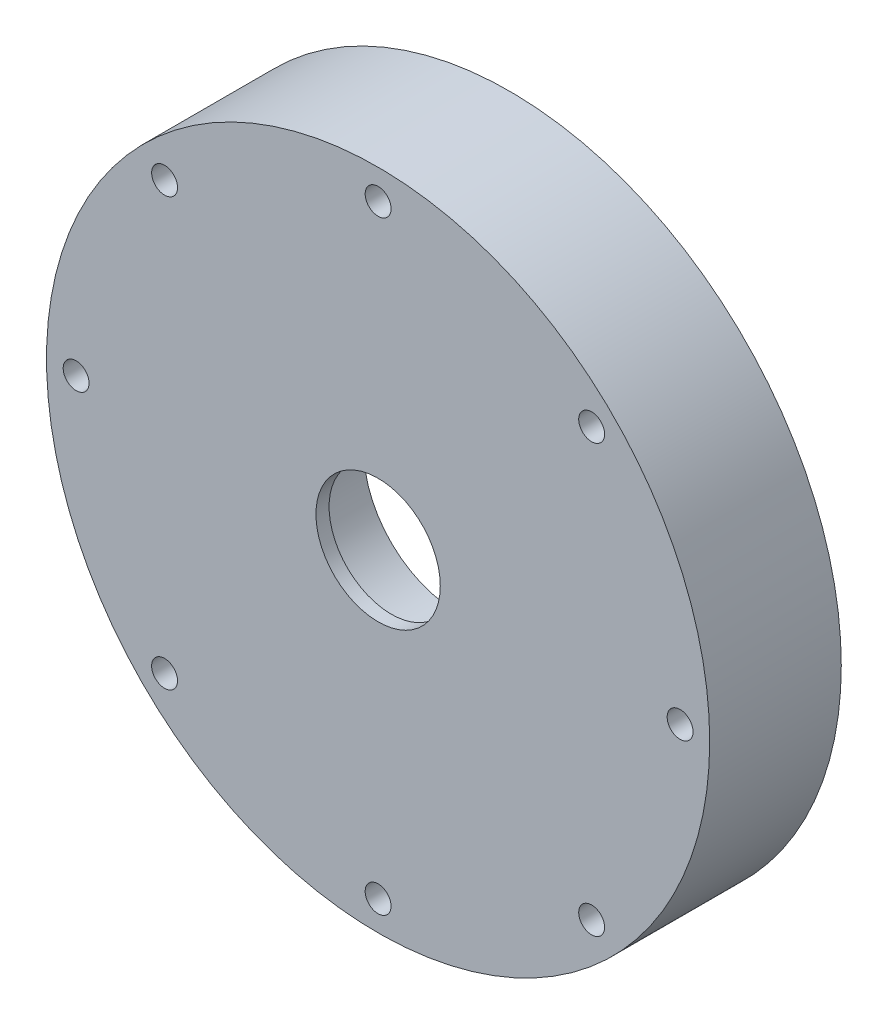
ISO-10303-21;
HEADER;
FILE_DESCRIPTION(('STEP AP214'),'2;1');
FILE_NAME('part.step','',(''),(''),'','','');
FILE_SCHEMA(('AUTOMOTIVE_DESIGN { 1 0 10303 214 1 1 1 1 }'));
ENDSEC;
DATA;
#1=APPLICATION_CONTEXT('core data for automotive mechanical design processes');
#2=APPLICATION_PROTOCOL_DEFINITION('international standard','automotive_design',2000,#1);
#3=PRODUCT_CONTEXT('',#1,'mechanical');
#4=PRODUCT('Part','Part','',(#3));
#5=PRODUCT_RELATED_PRODUCT_CATEGORY('part','',(#4));
#6=PRODUCT_DEFINITION_FORMATION('','',#4);
#7=PRODUCT_DEFINITION_CONTEXT('part definition',#1,'design');
#8=PRODUCT_DEFINITION('design','',#6,#7);
#9=PRODUCT_DEFINITION_SHAPE('','',#8);
#10=(LENGTH_UNIT() NAMED_UNIT(*) SI_UNIT(.MILLI.,.METRE.));
#11=(NAMED_UNIT(*) PLANE_ANGLE_UNIT() SI_UNIT($,.RADIAN.));
#12=(NAMED_UNIT(*) SI_UNIT($,.STERADIAN.) SOLID_ANGLE_UNIT());
#13=UNCERTAINTY_MEASURE_WITH_UNIT(LENGTH_MEASURE(1.E-05),#10,'distance_accuracy_value','');
#14=(GEOMETRIC_REPRESENTATION_CONTEXT(3) GLOBAL_UNCERTAINTY_ASSIGNED_CONTEXT((#13)) GLOBAL_UNIT_ASSIGNED_CONTEXT((#10,
#11,#12)) REPRESENTATION_CONTEXT('',''));
#15=CARTESIAN_POINT('',(0.,0.,0.));
#16=DIRECTION('',(0.,0.,1.));
#17=DIRECTION('',(1.,0.,0.));
#18=AXIS2_PLACEMENT_3D('',#15,#16,#17);
#19=CARTESIAN_POINT('',(0.,0.,0.));
#20=DIRECTION('',(0.,0.,-1.));
#21=DIRECTION('',(1.,0.,0.));
#22=AXIS2_PLACEMENT_3D('',#19,#20,#21);
#23=CYLINDRICAL_SURFACE('',#22,6.);
#24=CARTESIAN_POINT('',(0.,0.,0.));
#25=DIRECTION('',(0.,0.,1.));
#26=DIRECTION('',(1.,0.,0.));
#27=AXIS2_PLACEMENT_3D('',#24,#25,#26);
#28=CIRCLE('',#27,6.);
#29=CARTESIAN_POINT('',(6.,0.,0.));
#30=VERTEX_POINT('',#29);
#31=EDGE_CURVE('E163',#30,#30,#28,.T.);
#32=ORIENTED_EDGE('',*,*,#31,.T.);
#33=EDGE_LOOP('',(#32));
#34=FACE_BOUND('',#33,.T.);
#35=CARTESIAN_POINT('',(0.,0.,-1.27));
#36=DIRECTION('',(0.,0.,1.));
#37=DIRECTION('',(1.,0.,0.));
#38=AXIS2_PLACEMENT_3D('',#35,#36,#37);
#39=CIRCLE('',#38,6.);
#40=CARTESIAN_POINT('',(6.,0.,-1.27));
#41=VERTEX_POINT('',#40);
#42=EDGE_CURVE('E220',#41,#41,#39,.T.);
#43=ORIENTED_EDGE('',*,*,#42,.F.);
#44=EDGE_LOOP('',(#43));
#45=FACE_BOUND('',#44,.T.);
#46=ADVANCED_FACE('F45',(#34,#45),#23,.F.);
#47=CARTESIAN_POINT('',(0.,0.,-12.7));
#48=DIRECTION('',(0.,0.,1.));
#49=DIRECTION('',(-1.,0.,0.));
#50=AXIS2_PLACEMENT_3D('',#47,#48,#49);
#51=CYLINDRICAL_SURFACE('',#50,32.004);
#52=CARTESIAN_POINT('',(0.,0.,-12.7));
#53=DIRECTION('',(0.,0.,1.));
#54=DIRECTION('',(1.,0.,0.));
#55=AXIS2_PLACEMENT_3D('',#52,#53,#54);
#56=CIRCLE('',#55,32.004);
#57=CARTESIAN_POINT('',(32.004,0.,-12.7));
#58=VERTEX_POINT('',#57);
#59=EDGE_CURVE('E10',#58,#58,#56,.T.);
#60=ORIENTED_EDGE('',*,*,#59,.T.);
#61=EDGE_LOOP('',(#60));
#62=FACE_BOUND('',#61,.T.);
#63=CARTESIAN_POINT('',(0.,0.,0.));
#64=DIRECTION('',(0.,0.,1.));
#65=DIRECTION('',(1.,0.,0.));
#66=AXIS2_PLACEMENT_3D('',#63,#64,#65);
#67=CIRCLE('',#66,32.004);
#68=CARTESIAN_POINT('',(32.004,0.,0.));
#69=VERTEX_POINT('',#68);
#70=EDGE_CURVE('E49',#69,#69,#67,.T.);
#71=ORIENTED_EDGE('',*,*,#70,.F.);
#72=EDGE_LOOP('',(#71));
#73=FACE_BOUND('',#72,.T.);
#74=ADVANCED_FACE('F47',(#62,#73),#51,.T.);
#75=CARTESIAN_POINT('',(0.,0.,-12.7));
#76=DIRECTION('',(0.,0.,-1.));
#77=DIRECTION('',(1.,0.,0.));
#78=AXIS2_PLACEMENT_3D('',#75,#76,#77);
#79=PLANE('',#78);
#80=CARTESIAN_POINT('',(0.,29.1465,-12.7));
#81=DIRECTION('',(0.,0.,1.));
#82=DIRECTION('',(1.,0.,0.));
#83=AXIS2_PLACEMENT_3D('',#80,#81,#82);
#84=CIRCLE('',#83,1.25);
#85=CARTESIAN_POINT('',(1.25,29.1465,-12.7));
#86=VERTEX_POINT('',#85);
#87=EDGE_CURVE('E213',#86,#86,#84,.T.);
#88=ORIENTED_EDGE('',*,*,#87,.T.);
#89=EDGE_LOOP('',(#88));
#90=FACE_BOUND('',#89,.T.);
#91=CARTESIAN_POINT('',(20.6096877978537,20.6096877978537,-12.7));
#92=DIRECTION('',(0.,0.,1.));
#93=DIRECTION('',(1.,0.,0.));
#94=AXIS2_PLACEMENT_3D('',#91,#92,#93);
#95=CIRCLE('',#94,1.25);
#96=CARTESIAN_POINT('',(21.8596877978537,20.6096877978537,-12.7));
#97=VERTEX_POINT('',#96);
#98=EDGE_CURVE('E207',#97,#97,#95,.T.);
#99=ORIENTED_EDGE('',*,*,#98,.T.);
#100=EDGE_LOOP('',(#99));
#101=FACE_BOUND('',#100,.T.);
#102=CARTESIAN_POINT('',(29.1465,-1.01764460842591E-13,-12.7));
#103=DIRECTION('',(0.,0.,1.));
#104=DIRECTION('',(1.,0.,0.));
#105=AXIS2_PLACEMENT_3D('',#102,#103,#104);
#106=CIRCLE('',#105,1.25);
#107=CARTESIAN_POINT('',(30.3965,-1.01764460842591E-13,-12.7));
#108=VERTEX_POINT('',#107);
#109=EDGE_CURVE('E201',#108,#108,#106,.T.);
#110=ORIENTED_EDGE('',*,*,#109,.T.);
#111=EDGE_LOOP('',(#110));
#112=FACE_BOUND('',#111,.T.);
#113=CARTESIAN_POINT('',(20.6096877978536,-20.6096877978538,-12.7));
#114=DIRECTION('',(0.,0.,1.));
#115=DIRECTION('',(1.,0.,0.));
#116=AXIS2_PLACEMENT_3D('',#113,#114,#115);
#117=CIRCLE('',#116,1.25);
#118=CARTESIAN_POINT('',(21.8596877978536,-20.6096877978538,-12.7));
#119=VERTEX_POINT('',#118);
#120=EDGE_CURVE('E195',#119,#119,#117,.T.);
#121=ORIENTED_EDGE('',*,*,#120,.T.);
#122=EDGE_LOOP('',(#121));
#123=FACE_BOUND('',#122,.T.);
#124=CARTESIAN_POINT('',(-2.03528921685183E-13,-29.1465,-12.7));
#125=DIRECTION('',(0.,0.,1.));
#126=DIRECTION('',(1.,0.,0.));
#127=AXIS2_PLACEMENT_3D('',#124,#125,#126);
#128=CIRCLE('',#127,1.25);
#129=CARTESIAN_POINT('',(1.24999999999979,-29.1465,-12.7));
#130=VERTEX_POINT('',#129);
#131=EDGE_CURVE('E189',#130,#130,#128,.T.);
#132=ORIENTED_EDGE('',*,*,#131,.T.);
#133=EDGE_LOOP('',(#132));
#134=FACE_BOUND('',#133,.T.);
#135=CARTESIAN_POINT('',(-20.6096877978539,-20.6096877978535,-12.7));
#136=DIRECTION('',(0.,0.,1.));
#137=DIRECTION('',(1.,0.,0.));
#138=AXIS2_PLACEMENT_3D('',#135,#136,#137);
#139=CIRCLE('',#138,1.25);
#140=CARTESIAN_POINT('',(-19.3596877978539,-20.6096877978535,-12.7));
#141=VERTEX_POINT('',#140);
#142=EDGE_CURVE('E183',#141,#141,#139,.T.);
#143=ORIENTED_EDGE('',*,*,#142,.T.);
#144=EDGE_LOOP('',(#143));
#145=FACE_BOUND('',#144,.T.);
#146=CARTESIAN_POINT('',(-29.1465,3.05293382527774E-13,-12.7));
#147=DIRECTION('',(0.,0.,1.));
#148=DIRECTION('',(1.,0.,0.));
#149=AXIS2_PLACEMENT_3D('',#146,#147,#148);
#150=CIRCLE('',#149,1.25);
#151=CARTESIAN_POINT('',(-27.8965,3.05293382527774E-13,-12.7));
#152=VERTEX_POINT('',#151);
#153=EDGE_CURVE('E177',#152,#152,#150,.T.);
#154=ORIENTED_EDGE('',*,*,#153,.T.);
#155=EDGE_LOOP('',(#154));
#156=FACE_BOUND('',#155,.T.);
#157=CARTESIAN_POINT('',(-20.6096877978535,20.609687797854,-12.7));
#158=DIRECTION('',(0.,0.,1.));
#159=DIRECTION('',(1.,0.,0.));
#160=AXIS2_PLACEMENT_3D('',#157,#158,#159);
#161=CIRCLE('',#160,1.25);
#162=CARTESIAN_POINT('',(-19.3596877978535,20.609687797854,-12.7));
#163=VERTEX_POINT('',#162);
#164=EDGE_CURVE('E171',#163,#163,#161,.T.);
#165=ORIENTED_EDGE('',*,*,#164,.T.);
#166=EDGE_LOOP('',(#165));
#167=FACE_BOUND('',#166,.T.);
#168=CARTESIAN_POINT('',(0.,0.,-12.7));
#169=DIRECTION('',(0.,0.,1.));
#170=DIRECTION('',(1.,0.,0.));
#171=AXIS2_PLACEMENT_3D('',#168,#169,#170);
#172=CIRCLE('',#171,26.289);
#173=CARTESIAN_POINT('',(26.289,0.,-12.7));
#174=VERTEX_POINT('',#173);
#175=EDGE_CURVE('E58',#174,#174,#172,.T.);
#176=ORIENTED_EDGE('',*,*,#175,.T.);
#177=EDGE_LOOP('',(#176));
#178=FACE_BOUND('',#177,.T.);
#179=ORIENTED_EDGE('',*,*,#59,.F.);
#180=EDGE_LOOP('',(#179));
#181=FACE_BOUND('',#180,.T.);
#182=ADVANCED_FACE('F235',(#90,#101,#112,#123,#134,#145,#156,#167,#178,#181),#79,.T.);
#183=CARTESIAN_POINT('',(0.,0.,0.));
#184=DIRECTION('',(0.,0.,-1.));
#185=DIRECTION('',(1.,0.,0.));
#186=AXIS2_PLACEMENT_3D('',#183,#184,#185);
#187=PLANE('',#186);
#188=CARTESIAN_POINT('',(0.,29.1465,0.));
#189=DIRECTION('',(0.,0.,1.));
#190=DIRECTION('',(1.,0.,0.));
#191=AXIS2_PLACEMENT_3D('',#188,#189,#190);
#192=CIRCLE('',#191,1.25);
#193=CARTESIAN_POINT('',(1.25,29.1465,0.));
#194=VERTEX_POINT('',#193);
#195=EDGE_CURVE('E210',#194,#194,#192,.T.);
#196=ORIENTED_EDGE('',*,*,#195,.F.);
#197=EDGE_LOOP('',(#196));
#198=FACE_BOUND('',#197,.T.);
#199=CARTESIAN_POINT('',(20.6096877978537,20.6096877978537,0.));
#200=DIRECTION('',(0.,0.,1.));
#201=DIRECTION('',(1.,0.,0.));
#202=AXIS2_PLACEMENT_3D('',#199,#200,#201);
#203=CIRCLE('',#202,1.25);
#204=CARTESIAN_POINT('',(21.8596877978537,20.6096877978537,0.));
#205=VERTEX_POINT('',#204);
#206=EDGE_CURVE('E204',#205,#205,#203,.T.);
#207=ORIENTED_EDGE('',*,*,#206,.F.);
#208=EDGE_LOOP('',(#207));
#209=FACE_BOUND('',#208,.T.);
#210=CARTESIAN_POINT('',(29.1465,-1.01764460842591E-13,0.));
#211=DIRECTION('',(0.,0.,1.));
#212=DIRECTION('',(1.,0.,0.));
#213=AXIS2_PLACEMENT_3D('',#210,#211,#212);
#214=CIRCLE('',#213,1.25);
#215=CARTESIAN_POINT('',(30.3965,-1.01764460842591E-13,0.));
#216=VERTEX_POINT('',#215);
#217=EDGE_CURVE('E198',#216,#216,#214,.T.);
#218=ORIENTED_EDGE('',*,*,#217,.F.);
#219=EDGE_LOOP('',(#218));
#220=FACE_BOUND('',#219,.T.);
#221=CARTESIAN_POINT('',(20.6096877978536,-20.6096877978538,0.));
#222=DIRECTION('',(0.,0.,1.));
#223=DIRECTION('',(1.,0.,0.));
#224=AXIS2_PLACEMENT_3D('',#221,#222,#223);
#225=CIRCLE('',#224,1.25);
#226=CARTESIAN_POINT('',(21.8596877978536,-20.6096877978538,0.));
#227=VERTEX_POINT('',#226);
#228=EDGE_CURVE('E192',#227,#227,#225,.T.);
#229=ORIENTED_EDGE('',*,*,#228,.F.);
#230=EDGE_LOOP('',(#229));
#231=FACE_BOUND('',#230,.T.);
#232=CARTESIAN_POINT('',(-2.03528921685183E-13,-29.1465,0.));
#233=DIRECTION('',(0.,0.,1.));
#234=DIRECTION('',(1.,0.,0.));
#235=AXIS2_PLACEMENT_3D('',#232,#233,#234);
#236=CIRCLE('',#235,1.25);
#237=CARTESIAN_POINT('',(1.24999999999979,-29.1465,0.));
#238=VERTEX_POINT('',#237);
#239=EDGE_CURVE('E186',#238,#238,#236,.T.);
#240=ORIENTED_EDGE('',*,*,#239,.F.);
#241=EDGE_LOOP('',(#240));
#242=FACE_BOUND('',#241,.T.);
#243=CARTESIAN_POINT('',(-20.6096877978539,-20.6096877978535,0.));
#244=DIRECTION('',(0.,0.,1.));
#245=DIRECTION('',(1.,0.,0.));
#246=AXIS2_PLACEMENT_3D('',#243,#244,#245);
#247=CIRCLE('',#246,1.25);
#248=CARTESIAN_POINT('',(-19.3596877978539,-20.6096877978535,0.));
#249=VERTEX_POINT('',#248);
#250=EDGE_CURVE('E180',#249,#249,#247,.T.);
#251=ORIENTED_EDGE('',*,*,#250,.F.);
#252=EDGE_LOOP('',(#251));
#253=FACE_BOUND('',#252,.T.);
#254=CARTESIAN_POINT('',(-29.1465,3.05293382527774E-13,0.));
#255=DIRECTION('',(0.,0.,1.));
#256=DIRECTION('',(1.,0.,0.));
#257=AXIS2_PLACEMENT_3D('',#254,#255,#256);
#258=CIRCLE('',#257,1.25);
#259=CARTESIAN_POINT('',(-27.8965,3.05293382527774E-13,0.));
#260=VERTEX_POINT('',#259);
#261=EDGE_CURVE('E174',#260,#260,#258,.T.);
#262=ORIENTED_EDGE('',*,*,#261,.F.);
#263=EDGE_LOOP('',(#262));
#264=FACE_BOUND('',#263,.T.);
#265=CARTESIAN_POINT('',(-20.6096877978535,20.609687797854,0.));
#266=DIRECTION('',(0.,0.,1.));
#267=DIRECTION('',(1.,0.,0.));
#268=AXIS2_PLACEMENT_3D('',#265,#266,#267);
#269=CIRCLE('',#268,1.25);
#270=CARTESIAN_POINT('',(-19.3596877978535,20.609687797854,0.));
#271=VERTEX_POINT('',#270);
#272=EDGE_CURVE('E168',#271,#271,#269,.T.);
#273=ORIENTED_EDGE('',*,*,#272,.F.);
#274=EDGE_LOOP('',(#273));
#275=FACE_BOUND('',#274,.T.);
#276=ORIENTED_EDGE('',*,*,#31,.F.);
#277=EDGE_LOOP('',(#276));
#278=FACE_BOUND('',#277,.T.);
#279=ORIENTED_EDGE('',*,*,#70,.T.);
#280=EDGE_LOOP('',(#279));
#281=FACE_BOUND('',#280,.T.);
#282=ADVANCED_FACE('F383',(#198,#209,#220,#231,#242,#253,#264,#275,#278,#281),#187,.F.);
#283=CARTESIAN_POINT('',(0.,0.,-10.16));
#284=DIRECTION('',(0.,0.,-1.));
#285=DIRECTION('',(1.,0.,0.));
#286=AXIS2_PLACEMENT_3D('',#283,#284,#285);
#287=CYLINDRICAL_SURFACE('',#286,26.289);
#288=CARTESIAN_POINT('',(0.,0.,-10.16));
#289=DIRECTION('',(0.,0.,1.));
#290=DIRECTION('',(1.,0.,0.));
#291=AXIS2_PLACEMENT_3D('',#288,#289,#290);
#292=CIRCLE('',#291,26.289);
#293=CARTESIAN_POINT('',(26.289,0.,-10.16));
#294=VERTEX_POINT('',#293);
#295=EDGE_CURVE('E56',#294,#294,#292,.T.);
#296=ORIENTED_EDGE('',*,*,#295,.T.);
#297=EDGE_LOOP('',(#296));
#298=FACE_BOUND('',#297,.T.);
#299=ORIENTED_EDGE('',*,*,#175,.F.);
#300=EDGE_LOOP('',(#299));
#301=FACE_BOUND('',#300,.T.);
#302=ADVANCED_FACE('F379',(#298,#301),#287,.F.);
#303=CARTESIAN_POINT('',(0.,0.,-10.16));
#304=DIRECTION('',(0.,0.,-1.));
#305=DIRECTION('',(1.,0.,0.));
#306=AXIS2_PLACEMENT_3D('',#303,#304,#305);
#307=PLANE('',#306);
#308=CARTESIAN_POINT('',(0.,0.,-10.16));
#309=DIRECTION('',(0.,0.,1.));
#310=DIRECTION('',(1.,0.,0.));
#311=AXIS2_PLACEMENT_3D('',#308,#309,#310);
#312=CIRCLE('',#311,13.589);
#313=CARTESIAN_POINT('',(13.589,0.,-10.16));
#314=VERTEX_POINT('',#313);
#315=EDGE_CURVE('E160',#314,#314,#312,.T.);
#316=ORIENTED_EDGE('',*,*,#315,.T.);
#317=EDGE_LOOP('',(#316));
#318=FACE_BOUND('',#317,.T.);
#319=CARTESIAN_POINT('',(-8.11633291703092,19.594561005032,-10.16));
#320=DIRECTION('',(0.,0.,1.));
#321=DIRECTION('',(1.,0.,0.));
#322=AXIS2_PLACEMENT_3D('',#319,#320,#321);
#323=CIRCLE('',#322,1.905);
#324=CARTESIAN_POINT('',(-6.21133291703092,19.594561005032,-10.16));
#325=VERTEX_POINT('',#324);
#326=EDGE_CURVE('E73',#325,#325,#323,.T.);
#327=ORIENTED_EDGE('',*,*,#326,.T.);
#328=EDGE_LOOP('',(#327));
#329=FACE_BOUND('',#328,.T.);
#330=CARTESIAN_POINT('',(-14.9970277221855,14.9970277221855,-10.16));
#331=DIRECTION('',(0.,0.,1.));
#332=DIRECTION('',(1.,0.,0.));
#333=AXIS2_PLACEMENT_3D('',#330,#331,#332);
#334=CIRCLE('',#333,1.90500000000025);
#335=CARTESIAN_POINT('',(-13.0920277221852,14.9970277221855,-10.16));
#336=VERTEX_POINT('',#335);
#337=EDGE_CURVE('E80',#336,#336,#334,.T.);
#338=ORIENTED_EDGE('',*,*,#337,.T.);
#339=EDGE_LOOP('',(#338));
#340=FACE_BOUND('',#339,.T.);
#341=CARTESIAN_POINT('',(-19.5945610050319,8.11633291703119,-10.16));
#342=DIRECTION('',(0.,0.,1.));
#343=DIRECTION('',(1.,0.,0.));
#344=AXIS2_PLACEMENT_3D('',#341,#342,#343);
#345=CIRCLE('',#344,1.90500000000021);
#346=CARTESIAN_POINT('',(-17.6895610050317,8.11633291703119,-10.16));
#347=VERTEX_POINT('',#346);
#348=EDGE_CURVE('E86',#347,#347,#345,.T.);
#349=ORIENTED_EDGE('',*,*,#348,.T.);
#350=EDGE_LOOP('',(#349));
#351=FACE_BOUND('',#350,.T.);
#352=CARTESIAN_POINT('',(-21.209,0.,-10.16));
#353=DIRECTION('',(0.,0.,1.));
#354=DIRECTION('',(1.,0.,0.));
#355=AXIS2_PLACEMENT_3D('',#352,#353,#354);
#356=CIRCLE('',#355,1.90500000000022);
#357=CARTESIAN_POINT('',(-19.3039999999998,0.,-10.16));
#358=VERTEX_POINT('',#357);
#359=EDGE_CURVE('E92',#358,#358,#356,.T.);
#360=ORIENTED_EDGE('',*,*,#359,.T.);
#361=EDGE_LOOP('',(#360));
#362=FACE_BOUND('',#361,.T.);
#363=CARTESIAN_POINT('',(-19.5945610050319,-8.1163329170312,-10.16));
#364=DIRECTION('',(0.,0.,1.));
#365=DIRECTION('',(1.,0.,0.));
#366=AXIS2_PLACEMENT_3D('',#363,#364,#365);
#367=CIRCLE('',#366,1.90500000000021);
#368=CARTESIAN_POINT('',(-17.6895610050317,-8.1163329170312,-10.16));
#369=VERTEX_POINT('',#368);
#370=EDGE_CURVE('E98',#369,#369,#367,.T.);
#371=ORIENTED_EDGE('',*,*,#370,.T.);
#372=EDGE_LOOP('',(#371));
#373=FACE_BOUND('',#372,.T.);
#374=CARTESIAN_POINT('',(-14.9970277221855,-14.9970277221855,-10.16));
#375=DIRECTION('',(0.,0.,1.));
#376=DIRECTION('',(1.,0.,0.));
#377=AXIS2_PLACEMENT_3D('',#374,#375,#376);
#378=CIRCLE('',#377,1.90500000000018);
#379=CARTESIAN_POINT('',(-13.0920277221853,-14.9970277221855,-10.16));
#380=VERTEX_POINT('',#379);
#381=EDGE_CURVE('E104',#380,#380,#378,.T.);
#382=ORIENTED_EDGE('',*,*,#381,.T.);
#383=EDGE_LOOP('',(#382));
#384=FACE_BOUND('',#383,.T.);
#385=CARTESIAN_POINT('',(-8.11633291703119,-19.5945610050319,-10.16));
#386=DIRECTION('',(0.,0.,1.));
#387=DIRECTION('',(1.,0.,0.));
#388=AXIS2_PLACEMENT_3D('',#385,#386,#387);
#389=CIRCLE('',#388,1.90500000000016);
#390=CARTESIAN_POINT('',(-6.21133291703102,-19.5945610050319,-10.16));
#391=VERTEX_POINT('',#390);
#392=EDGE_CURVE('E110',#391,#391,#389,.T.);
#393=ORIENTED_EDGE('',*,*,#392,.T.);
#394=EDGE_LOOP('',(#393));
#395=FACE_BOUND('',#394,.T.);
#396=CARTESIAN_POINT('',(0.,-21.209,-10.16));
#397=DIRECTION('',(0.,0.,1.));
#398=DIRECTION('',(1.,0.,0.));
#399=AXIS2_PLACEMENT_3D('',#396,#397,#398);
#400=CIRCLE('',#399,1.90500000000014);
#401=CARTESIAN_POINT('',(1.90500000000015,-21.209,-10.16));
#402=VERTEX_POINT('',#401);
#403=EDGE_CURVE('E116',#402,#402,#400,.T.);
#404=ORIENTED_EDGE('',*,*,#403,.T.);
#405=EDGE_LOOP('',(#404));
#406=FACE_BOUND('',#405,.T.);
#407=CARTESIAN_POINT('',(8.11633291703119,-19.5945610050319,-10.16));
#408=DIRECTION('',(0.,0.,1.));
#409=DIRECTION('',(1.,0.,0.));
#410=AXIS2_PLACEMENT_3D('',#407,#408,#409);
#411=CIRCLE('',#410,1.90500000000013);
#412=CARTESIAN_POINT('',(10.0213329170313,-19.5945610050319,-10.16));
#413=VERTEX_POINT('',#412);
#414=EDGE_CURVE('E122',#413,#413,#411,.T.);
#415=ORIENTED_EDGE('',*,*,#414,.T.);
#416=EDGE_LOOP('',(#415));
#417=FACE_BOUND('',#416,.T.);
#418=CARTESIAN_POINT('',(14.9970277221855,-14.9970277221855,-10.16));
#419=DIRECTION('',(0.,0.,1.));
#420=DIRECTION('',(1.,0.,0.));
#421=AXIS2_PLACEMENT_3D('',#418,#419,#420);
#422=CIRCLE('',#421,1.90500000000011);
#423=CARTESIAN_POINT('',(16.9020277221856,-14.9970277221855,-10.16));
#424=VERTEX_POINT('',#423);
#425=EDGE_CURVE('E128',#424,#424,#422,.T.);
#426=ORIENTED_EDGE('',*,*,#425,.T.);
#427=EDGE_LOOP('',(#426));
#428=FACE_BOUND('',#427,.T.);
#429=CARTESIAN_POINT('',(19.5945610050319,-8.11633291703119,-10.16));
#430=DIRECTION('',(0.,0.,1.));
#431=DIRECTION('',(1.,0.,0.));
#432=AXIS2_PLACEMENT_3D('',#429,#430,#431);
#433=CIRCLE('',#432,1.90500000000009);
#434=CARTESIAN_POINT('',(21.499561005032,-8.11633291703119,-10.16));
#435=VERTEX_POINT('',#434);
#436=EDGE_CURVE('E134',#435,#435,#433,.T.);
#437=ORIENTED_EDGE('',*,*,#436,.T.);
#438=EDGE_LOOP('',(#437));
#439=FACE_BOUND('',#438,.T.);
#440=CARTESIAN_POINT('',(21.209,0.,-10.16));
#441=DIRECTION('',(0.,0.,1.));
#442=DIRECTION('',(1.,0.,0.));
#443=AXIS2_PLACEMENT_3D('',#440,#441,#442);
#444=CIRCLE('',#443,1.90500000000007);
#445=CARTESIAN_POINT('',(23.1140000000001,0.,-10.16));
#446=VERTEX_POINT('',#445);
#447=EDGE_CURVE('E140',#446,#446,#444,.T.);
#448=ORIENTED_EDGE('',*,*,#447,.T.);
#449=EDGE_LOOP('',(#448));
#450=FACE_BOUND('',#449,.T.);
#451=CARTESIAN_POINT('',(19.5945610050319,8.11633291703119,-10.16));
#452=DIRECTION('',(0.,0.,1.));
#453=DIRECTION('',(1.,0.,0.));
#454=AXIS2_PLACEMENT_3D('',#451,#452,#453);
#455=CIRCLE('',#454,1.90500000000005);
#456=CARTESIAN_POINT('',(21.4995610050319,8.11633291703119,-10.16));
#457=VERTEX_POINT('',#456);
#458=EDGE_CURVE('E146',#457,#457,#455,.T.);
#459=ORIENTED_EDGE('',*,*,#458,.T.);
#460=EDGE_LOOP('',(#459));
#461=FACE_BOUND('',#460,.T.);
#462=CARTESIAN_POINT('',(14.9970277221855,14.9970277221855,-10.16));
#463=DIRECTION('',(0.,0.,1.));
#464=DIRECTION('',(1.,0.,0.));
#465=AXIS2_PLACEMENT_3D('',#462,#463,#464);
#466=CIRCLE('',#465,1.90500000000004);
#467=CARTESIAN_POINT('',(16.9020277221855,14.9970277221855,-10.16));
#468=VERTEX_POINT('',#467);
#469=EDGE_CURVE('E152',#468,#468,#466,.T.);
#470=ORIENTED_EDGE('',*,*,#469,.T.);
#471=EDGE_LOOP('',(#470));
#472=FACE_BOUND('',#471,.T.);
#473=CARTESIAN_POINT('',(8.11633291703121,19.5945610050319,-10.16));
#474=DIRECTION('',(0.,0.,1.));
#475=DIRECTION('',(1.,0.,0.));
#476=AXIS2_PLACEMENT_3D('',#473,#474,#475);
#477=CIRCLE('',#476,1.905);
#478=CARTESIAN_POINT('',(10.0213329170312,19.5945610050319,-10.16));
#479=VERTEX_POINT('',#478);
#480=EDGE_CURVE('E67',#479,#479,#477,.T.);
#481=ORIENTED_EDGE('',*,*,#480,.T.);
#482=EDGE_LOOP('',(#481));
#483=FACE_BOUND('',#482,.T.);
#484=CARTESIAN_POINT('',(0.,21.209,-10.16));
#485=DIRECTION('',(0.,0.,1.));
#486=DIRECTION('',(1.,0.,0.));
#487=AXIS2_PLACEMENT_3D('',#484,#485,#486);
#488=CIRCLE('',#487,1.905);
#489=CARTESIAN_POINT('',(1.905,21.209,-10.16));
#490=VERTEX_POINT('',#489);
#491=EDGE_CURVE('E64',#490,#490,#488,.T.);
#492=ORIENTED_EDGE('',*,*,#491,.T.);
#493=EDGE_LOOP('',(#492));
#494=FACE_BOUND('',#493,.T.);
#495=ORIENTED_EDGE('',*,*,#295,.F.);
#496=EDGE_LOOP('',(#495));
#497=FACE_BOUND('',#496,.T.);
#498=ADVANCED_FACE('F375',(#318,#329,#340,#351,#362,#373,#384,#395,#406,#417,#428,#439,#450,
#461,#472,#483,#494,#497),#307,.T.);
#499=CARTESIAN_POINT('',(0.,21.209,-7.62));
#500=DIRECTION('',(0.,0.,-1.));
#501=DIRECTION('',(1.,0.,0.));
#502=AXIS2_PLACEMENT_3D('',#499,#500,#501);
#503=CYLINDRICAL_SURFACE('',#502,1.905);
#504=CARTESIAN_POINT('',(0.,21.209,-7.62));
#505=DIRECTION('',(0.,0.,1.));
#506=DIRECTION('',(1.,0.,0.));
#507=AXIS2_PLACEMENT_3D('',#504,#505,#506);
#508=CIRCLE('',#507,1.905);
#509=CARTESIAN_POINT('',(1.905,21.209,-7.62));
#510=VERTEX_POINT('',#509);
#511=EDGE_CURVE('E61',#510,#510,#508,.T.);
#512=ORIENTED_EDGE('',*,*,#511,.T.);
#513=EDGE_LOOP('',(#512));
#514=FACE_BOUND('',#513,.T.);
#515=ORIENTED_EDGE('',*,*,#491,.F.);
#516=EDGE_LOOP('',(#515));
#517=FACE_BOUND('',#516,.T.);
#518=ADVANCED_FACE('F371',(#514,#517),#503,.F.);
#519=CARTESIAN_POINT('',(0.,21.209,-7.62));
#520=DIRECTION('',(0.,0.,-1.));
#521=DIRECTION('',(1.,0.,0.));
#522=AXIS2_PLACEMENT_3D('',#519,#520,#521);
#523=PLANE('',#522);
#524=ORIENTED_EDGE('',*,*,#511,.F.);
#525=EDGE_LOOP('',(#524));
#526=FACE_BOUND('',#525,.T.);
#527=ADVANCED_FACE('F253',(#526),#523,.T.);
#528=CARTESIAN_POINT('',(8.11633291703121,19.5945610050319,-7.62));
#529=DIRECTION('',(0.,0.,-1.));
#530=DIRECTION('',(1.,0.,0.));
#531=AXIS2_PLACEMENT_3D('',#528,#529,#530);
#532=CYLINDRICAL_SURFACE('',#531,1.905);
#533=CARTESIAN_POINT('',(8.11633291703121,19.5945610050319,-7.62));
#534=DIRECTION('',(0.,0.,1.));
#535=DIRECTION('',(1.,0.,0.));
#536=AXIS2_PLACEMENT_3D('',#533,#534,#535);
#537=CIRCLE('',#536,1.905);
#538=CARTESIAN_POINT('',(10.0213329170312,19.5945610050319,-7.62));
#539=VERTEX_POINT('',#538);
#540=EDGE_CURVE('E155',#539,#539,#537,.T.);
#541=ORIENTED_EDGE('',*,*,#540,.T.);
#542=EDGE_LOOP('',(#541));
#543=FACE_BOUND('',#542,.T.);
#544=ORIENTED_EDGE('',*,*,#480,.F.);
#545=EDGE_LOOP('',(#544));
#546=FACE_BOUND('',#545,.T.);
#547=ADVANCED_FACE('F249',(#543,#546),#532,.F.);
#548=CARTESIAN_POINT('',(8.11633291703121,19.5945610050319,-7.62));
#549=DIRECTION('',(0.,0.,-1.));
#550=DIRECTION('',(1.,0.,0.));
#551=AXIS2_PLACEMENT_3D('',#548,#549,#550);
#552=PLANE('',#551);
#553=ORIENTED_EDGE('',*,*,#540,.F.);
#554=EDGE_LOOP('',(#553));
#555=FACE_BOUND('',#554,.T.);
#556=ADVANCED_FACE('F252',(#555),#552,.T.);
#557=CARTESIAN_POINT('',(14.9970277221855,14.9970277221855,-7.62));
#558=DIRECTION('',(0.,0.,-1.));
#559=DIRECTION('',(1.,0.,0.));
#560=AXIS2_PLACEMENT_3D('',#557,#558,#559);
#561=CYLINDRICAL_SURFACE('',#560,1.90500000000004);
#562=CARTESIAN_POINT('',(14.9970277221855,14.9970277221855,-7.62));
#563=DIRECTION('',(0.,0.,1.));
#564=DIRECTION('',(1.,0.,0.));
#565=AXIS2_PLACEMENT_3D('',#562,#563,#564);
#566=CIRCLE('',#565,1.90500000000004);
#567=CARTESIAN_POINT('',(16.9020277221855,14.9970277221855,-7.62));
#568=VERTEX_POINT('',#567);
#569=EDGE_CURVE('E149',#568,#568,#566,.T.);
#570=ORIENTED_EDGE('',*,*,#569,.T.);
#571=EDGE_LOOP('',(#570));
#572=FACE_BOUND('',#571,.T.);
#573=ORIENTED_EDGE('',*,*,#469,.F.);
#574=EDGE_LOOP('',(#573));
#575=FACE_BOUND('',#574,.T.);
#576=ADVANCED_FACE('F257',(#572,#575),#561,.F.);
#577=CARTESIAN_POINT('',(14.9970277221855,14.9970277221855,-7.62));
#578=DIRECTION('',(0.,0.,-1.));
#579=DIRECTION('',(1.,0.,0.));
#580=AXIS2_PLACEMENT_3D('',#577,#578,#579);
#581=PLANE('',#580);
#582=ORIENTED_EDGE('',*,*,#569,.F.);
#583=EDGE_LOOP('',(#582));
#584=FACE_BOUND('',#583,.T.);
#585=ADVANCED_FACE('F261',(#584),#581,.T.);
#586=CARTESIAN_POINT('',(19.5945610050319,8.11633291703119,-7.62));
#587=DIRECTION('',(0.,0.,-1.));
#588=DIRECTION('',(1.,0.,0.));
#589=AXIS2_PLACEMENT_3D('',#586,#587,#588);
#590=CYLINDRICAL_SURFACE('',#589,1.90500000000005);
#591=CARTESIAN_POINT('',(19.5945610050319,8.11633291703119,-7.62));
#592=DIRECTION('',(0.,0.,1.));
#593=DIRECTION('',(1.,0.,0.));
#594=AXIS2_PLACEMENT_3D('',#591,#592,#593);
#595=CIRCLE('',#594,1.90500000000005);
#596=CARTESIAN_POINT('',(21.4995610050319,8.11633291703119,-7.62));
#597=VERTEX_POINT('',#596);
#598=EDGE_CURVE('E143',#597,#597,#595,.T.);
#599=ORIENTED_EDGE('',*,*,#598,.T.);
#600=EDGE_LOOP('',(#599));
#601=FACE_BOUND('',#600,.T.);
#602=ORIENTED_EDGE('',*,*,#458,.F.);
#603=EDGE_LOOP('',(#602));
#604=FACE_BOUND('',#603,.T.);
#605=ADVANCED_FACE('F265',(#601,#604),#590,.F.);
#606=CARTESIAN_POINT('',(19.5945610050319,8.11633291703119,-7.62));
#607=DIRECTION('',(0.,0.,-1.));
#608=DIRECTION('',(1.,0.,0.));
#609=AXIS2_PLACEMENT_3D('',#606,#607,#608);
#610=PLANE('',#609);
#611=ORIENTED_EDGE('',*,*,#598,.F.);
#612=EDGE_LOOP('',(#611));
#613=FACE_BOUND('',#612,.T.);
#614=ADVANCED_FACE('F269',(#613),#610,.T.);
#615=CARTESIAN_POINT('',(21.209,0.,-7.62));
#616=DIRECTION('',(0.,0.,-1.));
#617=DIRECTION('',(1.,0.,0.));
#618=AXIS2_PLACEMENT_3D('',#615,#616,#617);
#619=CYLINDRICAL_SURFACE('',#618,1.90500000000007);
#620=CARTESIAN_POINT('',(21.209,0.,-7.62));
#621=DIRECTION('',(0.,0.,1.));
#622=DIRECTION('',(1.,0.,0.));
#623=AXIS2_PLACEMENT_3D('',#620,#621,#622);
#624=CIRCLE('',#623,1.90500000000007);
#625=CARTESIAN_POINT('',(23.1140000000001,0.,-7.62));
#626=VERTEX_POINT('',#625);
#627=EDGE_CURVE('E137',#626,#626,#624,.T.);
#628=ORIENTED_EDGE('',*,*,#627,.T.);
#629=EDGE_LOOP('',(#628));
#630=FACE_BOUND('',#629,.T.);
#631=ORIENTED_EDGE('',*,*,#447,.F.);
#632=EDGE_LOOP('',(#631));
#633=FACE_BOUND('',#632,.T.);
#634=ADVANCED_FACE('F273',(#630,#633),#619,.F.);
#635=CARTESIAN_POINT('',(21.209,0.,-7.62));
#636=DIRECTION('',(0.,0.,-1.));
#637=DIRECTION('',(1.,0.,0.));
#638=AXIS2_PLACEMENT_3D('',#635,#636,#637);
#639=PLANE('',#638);
#640=ORIENTED_EDGE('',*,*,#627,.F.);
#641=EDGE_LOOP('',(#640));
#642=FACE_BOUND('',#641,.T.);
#643=ADVANCED_FACE('F277',(#642),#639,.T.);
#644=CARTESIAN_POINT('',(19.5945610050319,-8.11633291703119,-7.62));
#645=DIRECTION('',(0.,0.,-1.));
#646=DIRECTION('',(1.,0.,0.));
#647=AXIS2_PLACEMENT_3D('',#644,#645,#646);
#648=CYLINDRICAL_SURFACE('',#647,1.90500000000009);
#649=CARTESIAN_POINT('',(19.5945610050319,-8.11633291703119,-7.62));
#650=DIRECTION('',(0.,0.,1.));
#651=DIRECTION('',(1.,0.,0.));
#652=AXIS2_PLACEMENT_3D('',#649,#650,#651);
#653=CIRCLE('',#652,1.90500000000009);
#654=CARTESIAN_POINT('',(21.499561005032,-8.11633291703119,-7.62));
#655=VERTEX_POINT('',#654);
#656=EDGE_CURVE('E131',#655,#655,#653,.T.);
#657=ORIENTED_EDGE('',*,*,#656,.T.);
#658=EDGE_LOOP('',(#657));
#659=FACE_BOUND('',#658,.T.);
#660=ORIENTED_EDGE('',*,*,#436,.F.);
#661=EDGE_LOOP('',(#660));
#662=FACE_BOUND('',#661,.T.);
#663=ADVANCED_FACE('F281',(#659,#662),#648,.F.);
#664=CARTESIAN_POINT('',(19.5945610050319,-8.11633291703119,-7.62));
#665=DIRECTION('',(0.,0.,-1.));
#666=DIRECTION('',(1.,0.,0.));
#667=AXIS2_PLACEMENT_3D('',#664,#665,#666);
#668=PLANE('',#667);
#669=ORIENTED_EDGE('',*,*,#656,.F.);
#670=EDGE_LOOP('',(#669));
#671=FACE_BOUND('',#670,.T.);
#672=ADVANCED_FACE('F285',(#671),#668,.T.);
#673=CARTESIAN_POINT('',(14.9970277221855,-14.9970277221855,-7.62));
#674=DIRECTION('',(0.,0.,-1.));
#675=DIRECTION('',(1.,0.,0.));
#676=AXIS2_PLACEMENT_3D('',#673,#674,#675);
#677=CYLINDRICAL_SURFACE('',#676,1.90500000000011);
#678=CARTESIAN_POINT('',(14.9970277221855,-14.9970277221855,-7.62));
#679=DIRECTION('',(0.,0.,1.));
#680=DIRECTION('',(1.,0.,0.));
#681=AXIS2_PLACEMENT_3D('',#678,#679,#680);
#682=CIRCLE('',#681,1.90500000000011);
#683=CARTESIAN_POINT('',(16.9020277221856,-14.9970277221855,-7.62));
#684=VERTEX_POINT('',#683);
#685=EDGE_CURVE('E125',#684,#684,#682,.T.);
#686=ORIENTED_EDGE('',*,*,#685,.T.);
#687=EDGE_LOOP('',(#686));
#688=FACE_BOUND('',#687,.T.);
#689=ORIENTED_EDGE('',*,*,#425,.F.);
#690=EDGE_LOOP('',(#689));
#691=FACE_BOUND('',#690,.T.);
#692=ADVANCED_FACE('F289',(#688,#691),#677,.F.);
#693=CARTESIAN_POINT('',(14.9970277221855,-14.9970277221855,-7.62));
#694=DIRECTION('',(0.,0.,-1.));
#695=DIRECTION('',(1.,0.,0.));
#696=AXIS2_PLACEMENT_3D('',#693,#694,#695);
#697=PLANE('',#696);
#698=ORIENTED_EDGE('',*,*,#685,.F.);
#699=EDGE_LOOP('',(#698));
#700=FACE_BOUND('',#699,.T.);
#701=ADVANCED_FACE('F293',(#700),#697,.T.);
#702=CARTESIAN_POINT('',(8.11633291703119,-19.5945610050319,-7.62));
#703=DIRECTION('',(0.,0.,-1.));
#704=DIRECTION('',(1.,0.,0.));
#705=AXIS2_PLACEMENT_3D('',#702,#703,#704);
#706=CYLINDRICAL_SURFACE('',#705,1.90500000000013);
#707=CARTESIAN_POINT('',(8.11633291703119,-19.5945610050319,-7.62));
#708=DIRECTION('',(0.,0.,1.));
#709=DIRECTION('',(1.,0.,0.));
#710=AXIS2_PLACEMENT_3D('',#707,#708,#709);
#711=CIRCLE('',#710,1.90500000000013);
#712=CARTESIAN_POINT('',(10.0213329170313,-19.5945610050319,-7.62));
#713=VERTEX_POINT('',#712);
#714=EDGE_CURVE('E119',#713,#713,#711,.T.);
#715=ORIENTED_EDGE('',*,*,#714,.T.);
#716=EDGE_LOOP('',(#715));
#717=FACE_BOUND('',#716,.T.);
#718=ORIENTED_EDGE('',*,*,#414,.F.);
#719=EDGE_LOOP('',(#718));
#720=FACE_BOUND('',#719,.T.);
#721=ADVANCED_FACE('F297',(#717,#720),#706,.F.);
#722=CARTESIAN_POINT('',(8.11633291703119,-19.5945610050319,-7.62));
#723=DIRECTION('',(0.,0.,-1.));
#724=DIRECTION('',(1.,0.,0.));
#725=AXIS2_PLACEMENT_3D('',#722,#723,#724);
#726=PLANE('',#725);
#727=ORIENTED_EDGE('',*,*,#714,.F.);
#728=EDGE_LOOP('',(#727));
#729=FACE_BOUND('',#728,.T.);
#730=ADVANCED_FACE('F301',(#729),#726,.T.);
#731=CARTESIAN_POINT('',(0.,-21.209,-7.62));
#732=DIRECTION('',(0.,0.,-1.));
#733=DIRECTION('',(1.,0.,0.));
#734=AXIS2_PLACEMENT_3D('',#731,#732,#733);
#735=CYLINDRICAL_SURFACE('',#734,1.90500000000014);
#736=CARTESIAN_POINT('',(0.,-21.209,-7.62));
#737=DIRECTION('',(0.,0.,1.));
#738=DIRECTION('',(1.,0.,0.));
#739=AXIS2_PLACEMENT_3D('',#736,#737,#738);
#740=CIRCLE('',#739,1.90500000000014);
#741=CARTESIAN_POINT('',(1.90500000000015,-21.209,-7.62));
#742=VERTEX_POINT('',#741);
#743=EDGE_CURVE('E113',#742,#742,#740,.T.);
#744=ORIENTED_EDGE('',*,*,#743,.T.);
#745=EDGE_LOOP('',(#744));
#746=FACE_BOUND('',#745,.T.);
#747=ORIENTED_EDGE('',*,*,#403,.F.);
#748=EDGE_LOOP('',(#747));
#749=FACE_BOUND('',#748,.T.);
#750=ADVANCED_FACE('F305',(#746,#749),#735,.F.);
#751=CARTESIAN_POINT('',(0.,-21.209,-7.62));
#752=DIRECTION('',(0.,0.,-1.));
#753=DIRECTION('',(1.,0.,0.));
#754=AXIS2_PLACEMENT_3D('',#751,#752,#753);
#755=PLANE('',#754);
#756=ORIENTED_EDGE('',*,*,#743,.F.);
#757=EDGE_LOOP('',(#756));
#758=FACE_BOUND('',#757,.T.);
#759=ADVANCED_FACE('F309',(#758),#755,.T.);
#760=CARTESIAN_POINT('',(-8.11633291703119,-19.5945610050319,-7.62));
#761=DIRECTION('',(0.,0.,-1.));
#762=DIRECTION('',(1.,0.,0.));
#763=AXIS2_PLACEMENT_3D('',#760,#761,#762);
#764=CYLINDRICAL_SURFACE('',#763,1.90500000000016);
#765=CARTESIAN_POINT('',(-8.11633291703119,-19.5945610050319,-7.62));
#766=DIRECTION('',(0.,0.,1.));
#767=DIRECTION('',(1.,0.,0.));
#768=AXIS2_PLACEMENT_3D('',#765,#766,#767);
#769=CIRCLE('',#768,1.90500000000016);
#770=CARTESIAN_POINT('',(-6.21133291703102,-19.5945610050319,-7.62));
#771=VERTEX_POINT('',#770);
#772=EDGE_CURVE('E107',#771,#771,#769,.T.);
#773=ORIENTED_EDGE('',*,*,#772,.T.);
#774=EDGE_LOOP('',(#773));
#775=FACE_BOUND('',#774,.T.);
#776=ORIENTED_EDGE('',*,*,#392,.F.);
#777=EDGE_LOOP('',(#776));
#778=FACE_BOUND('',#777,.T.);
#779=ADVANCED_FACE('F313',(#775,#778),#764,.F.);
#780=CARTESIAN_POINT('',(-8.11633291703119,-19.5945610050319,-7.62));
#781=DIRECTION('',(0.,0.,-1.));
#782=DIRECTION('',(1.,0.,0.));
#783=AXIS2_PLACEMENT_3D('',#780,#781,#782);
#784=PLANE('',#783);
#785=ORIENTED_EDGE('',*,*,#772,.F.);
#786=EDGE_LOOP('',(#785));
#787=FACE_BOUND('',#786,.T.);
#788=ADVANCED_FACE('F317',(#787),#784,.T.);
#789=CARTESIAN_POINT('',(-14.9970277221855,-14.9970277221855,-7.62));
#790=DIRECTION('',(0.,0.,-1.));
#791=DIRECTION('',(1.,0.,0.));
#792=AXIS2_PLACEMENT_3D('',#789,#790,#791);
#793=CYLINDRICAL_SURFACE('',#792,1.90500000000018);
#794=CARTESIAN_POINT('',(-14.9970277221855,-14.9970277221855,-7.62));
#795=DIRECTION('',(0.,0.,1.));
#796=DIRECTION('',(1.,0.,0.));
#797=AXIS2_PLACEMENT_3D('',#794,#795,#796);
#798=CIRCLE('',#797,1.90500000000018);
#799=CARTESIAN_POINT('',(-13.0920277221853,-14.9970277221855,-7.62));
#800=VERTEX_POINT('',#799);
#801=EDGE_CURVE('E101',#800,#800,#798,.T.);
#802=ORIENTED_EDGE('',*,*,#801,.T.);
#803=EDGE_LOOP('',(#802));
#804=FACE_BOUND('',#803,.T.);
#805=ORIENTED_EDGE('',*,*,#381,.F.);
#806=EDGE_LOOP('',(#805));
#807=FACE_BOUND('',#806,.T.);
#808=ADVANCED_FACE('F321',(#804,#807),#793,.F.);
#809=CARTESIAN_POINT('',(-14.9970277221855,-14.9970277221855,-7.62));
#810=DIRECTION('',(0.,0.,-1.));
#811=DIRECTION('',(1.,0.,0.));
#812=AXIS2_PLACEMENT_3D('',#809,#810,#811);
#813=PLANE('',#812);
#814=ORIENTED_EDGE('',*,*,#801,.F.);
#815=EDGE_LOOP('',(#814));
#816=FACE_BOUND('',#815,.T.);
#817=ADVANCED_FACE('F325',(#816),#813,.T.);
#818=CARTESIAN_POINT('',(-19.5945610050319,-8.1163329170312,-7.62));
#819=DIRECTION('',(0.,0.,-1.));
#820=DIRECTION('',(1.,0.,0.));
#821=AXIS2_PLACEMENT_3D('',#818,#819,#820);
#822=CYLINDRICAL_SURFACE('',#821,1.90500000000021);
#823=CARTESIAN_POINT('',(-19.5945610050319,-8.1163329170312,-7.62));
#824=DIRECTION('',(0.,0.,1.));
#825=DIRECTION('',(1.,0.,0.));
#826=AXIS2_PLACEMENT_3D('',#823,#824,#825);
#827=CIRCLE('',#826,1.90500000000021);
#828=CARTESIAN_POINT('',(-17.6895610050317,-8.1163329170312,-7.62));
#829=VERTEX_POINT('',#828);
#830=EDGE_CURVE('E95',#829,#829,#827,.T.);
#831=ORIENTED_EDGE('',*,*,#830,.T.);
#832=EDGE_LOOP('',(#831));
#833=FACE_BOUND('',#832,.T.);
#834=ORIENTED_EDGE('',*,*,#370,.F.);
#835=EDGE_LOOP('',(#834));
#836=FACE_BOUND('',#835,.T.);
#837=ADVANCED_FACE('F329',(#833,#836),#822,.F.);
#838=CARTESIAN_POINT('',(-19.5945610050319,-8.1163329170312,-7.62));
#839=DIRECTION('',(0.,0.,-1.));
#840=DIRECTION('',(1.,0.,0.));
#841=AXIS2_PLACEMENT_3D('',#838,#839,#840);
#842=PLANE('',#841);
#843=ORIENTED_EDGE('',*,*,#830,.F.);
#844=EDGE_LOOP('',(#843));
#845=FACE_BOUND('',#844,.T.);
#846=ADVANCED_FACE('F333',(#845),#842,.T.);
#847=CARTESIAN_POINT('',(-21.209,0.,-7.62));
#848=DIRECTION('',(0.,0.,-1.));
#849=DIRECTION('',(1.,0.,0.));
#850=AXIS2_PLACEMENT_3D('',#847,#848,#849);
#851=CYLINDRICAL_SURFACE('',#850,1.90500000000022);
#852=CARTESIAN_POINT('',(-21.209,0.,-7.62));
#853=DIRECTION('',(0.,0.,1.));
#854=DIRECTION('',(1.,0.,0.));
#855=AXIS2_PLACEMENT_3D('',#852,#853,#854);
#856=CIRCLE('',#855,1.90500000000022);
#857=CARTESIAN_POINT('',(-19.3039999999998,0.,-7.62));
#858=VERTEX_POINT('',#857);
#859=EDGE_CURVE('E89',#858,#858,#856,.T.);
#860=ORIENTED_EDGE('',*,*,#859,.T.);
#861=EDGE_LOOP('',(#860));
#862=FACE_BOUND('',#861,.T.);
#863=ORIENTED_EDGE('',*,*,#359,.F.);
#864=EDGE_LOOP('',(#863));
#865=FACE_BOUND('',#864,.T.);
#866=ADVANCED_FACE('F337',(#862,#865),#851,.F.);
#867=CARTESIAN_POINT('',(-21.209,0.,-7.62));
#868=DIRECTION('',(0.,0.,-1.));
#869=DIRECTION('',(1.,0.,0.));
#870=AXIS2_PLACEMENT_3D('',#867,#868,#869);
#871=PLANE('',#870);
#872=ORIENTED_EDGE('',*,*,#859,.F.);
#873=EDGE_LOOP('',(#872));
#874=FACE_BOUND('',#873,.T.);
#875=ADVANCED_FACE('F341',(#874),#871,.T.);
#876=CARTESIAN_POINT('',(-19.5945610050319,8.11633291703119,-7.62));
#877=DIRECTION('',(0.,0.,-1.));
#878=DIRECTION('',(1.,0.,0.));
#879=AXIS2_PLACEMENT_3D('',#876,#877,#878);
#880=CYLINDRICAL_SURFACE('',#879,1.90500000000021);
#881=CARTESIAN_POINT('',(-19.5945610050319,8.11633291703119,-7.62));
#882=DIRECTION('',(0.,0.,1.));
#883=DIRECTION('',(1.,0.,0.));
#884=AXIS2_PLACEMENT_3D('',#881,#882,#883);
#885=CIRCLE('',#884,1.90500000000021);
#886=CARTESIAN_POINT('',(-17.6895610050317,8.11633291703119,-7.62));
#887=VERTEX_POINT('',#886);
#888=EDGE_CURVE('E83',#887,#887,#885,.T.);
#889=ORIENTED_EDGE('',*,*,#888,.T.);
#890=EDGE_LOOP('',(#889));
#891=FACE_BOUND('',#890,.T.);
#892=ORIENTED_EDGE('',*,*,#348,.F.);
#893=EDGE_LOOP('',(#892));
#894=FACE_BOUND('',#893,.T.);
#895=ADVANCED_FACE('F345',(#891,#894),#880,.F.);
#896=CARTESIAN_POINT('',(-19.5945610050319,8.11633291703119,-7.62));
#897=DIRECTION('',(0.,0.,-1.));
#898=DIRECTION('',(1.,0.,0.));
#899=AXIS2_PLACEMENT_3D('',#896,#897,#898);
#900=PLANE('',#899);
#901=ORIENTED_EDGE('',*,*,#888,.F.);
#902=EDGE_LOOP('',(#901));
#903=FACE_BOUND('',#902,.T.);
#904=ADVANCED_FACE('F349',(#903),#900,.T.);
#905=CARTESIAN_POINT('',(-14.9970277221855,14.9970277221855,-7.62));
#906=DIRECTION('',(0.,0.,-1.));
#907=DIRECTION('',(1.,0.,0.));
#908=AXIS2_PLACEMENT_3D('',#905,#906,#907);
#909=CYLINDRICAL_SURFACE('',#908,1.90500000000025);
#910=CARTESIAN_POINT('',(-14.9970277221855,14.9970277221855,-7.62));
#911=DIRECTION('',(0.,0.,1.));
#912=DIRECTION('',(1.,0.,0.));
#913=AXIS2_PLACEMENT_3D('',#910,#911,#912);
#914=CIRCLE('',#913,1.90500000000025);
#915=CARTESIAN_POINT('',(-13.0920277221852,14.9970277221855,-7.62));
#916=VERTEX_POINT('',#915);
#917=EDGE_CURVE('E77',#916,#916,#914,.T.);
#918=ORIENTED_EDGE('',*,*,#917,.T.);
#919=EDGE_LOOP('',(#918));
#920=FACE_BOUND('',#919,.T.);
#921=ORIENTED_EDGE('',*,*,#337,.F.);
#922=EDGE_LOOP('',(#921));
#923=FACE_BOUND('',#922,.T.);
#924=ADVANCED_FACE('F353',(#920,#923),#909,.F.);
#925=CARTESIAN_POINT('',(-14.9970277221855,14.9970277221855,-7.62));
#926=DIRECTION('',(0.,0.,-1.));
#927=DIRECTION('',(1.,0.,0.));
#928=AXIS2_PLACEMENT_3D('',#925,#926,#927);
#929=PLANE('',#928);
#930=ORIENTED_EDGE('',*,*,#917,.F.);
#931=EDGE_LOOP('',(#930));
#932=FACE_BOUND('',#931,.T.);
#933=ADVANCED_FACE('F357',(#932),#929,.T.);
#934=CARTESIAN_POINT('',(-8.11633291703092,19.594561005032,-7.62));
#935=DIRECTION('',(0.,0.,-1.));
#936=DIRECTION('',(1.,0.,0.));
#937=AXIS2_PLACEMENT_3D('',#934,#935,#936);
#938=CYLINDRICAL_SURFACE('',#937,1.905);
#939=CARTESIAN_POINT('',(-8.11633291703092,19.594561005032,-7.62));
#940=DIRECTION('',(0.,0.,1.));
#941=DIRECTION('',(1.,0.,0.));
#942=AXIS2_PLACEMENT_3D('',#939,#940,#941);
#943=CIRCLE('',#942,1.905);
#944=CARTESIAN_POINT('',(-6.21133291703092,19.594561005032,-7.62));
#945=VERTEX_POINT('',#944);
#946=EDGE_CURVE('E70',#945,#945,#943,.T.);
#947=ORIENTED_EDGE('',*,*,#946,.T.);
#948=EDGE_LOOP('',(#947));
#949=FACE_BOUND('',#948,.T.);
#950=ORIENTED_EDGE('',*,*,#326,.F.);
#951=EDGE_LOOP('',(#950));
#952=FACE_BOUND('',#951,.T.);
#953=ADVANCED_FACE('F361',(#949,#952),#938,.F.);
#954=CARTESIAN_POINT('',(-8.11633291703092,19.594561005032,-7.62));
#955=DIRECTION('',(0.,0.,-1.));
#956=DIRECTION('',(1.,0.,0.));
#957=AXIS2_PLACEMENT_3D('',#954,#955,#956);
#958=PLANE('',#957);
#959=ORIENTED_EDGE('',*,*,#946,.F.);
#960=EDGE_LOOP('',(#959));
#961=FACE_BOUND('',#960,.T.);
#962=ADVANCED_FACE('F247',(#961),#958,.T.);
#963=CARTESIAN_POINT('',(0.,0.,-7.62));
#964=DIRECTION('',(0.,0.,-1.));
#965=DIRECTION('',(1.,0.,0.));
#966=AXIS2_PLACEMENT_3D('',#963,#964,#965);
#967=CYLINDRICAL_SURFACE('',#966,13.589);
#968=CARTESIAN_POINT('',(0.,0.,-7.62));
#969=DIRECTION('',(0.,0.,1.));
#970=DIRECTION('',(1.,0.,0.));
#971=AXIS2_PLACEMENT_3D('',#968,#969,#970);
#972=CIRCLE('',#971,13.589);
#973=CARTESIAN_POINT('',(13.589,0.,-7.62));
#974=VERTEX_POINT('',#973);
#975=EDGE_CURVE('E74',#974,#974,#972,.T.);
#976=ORIENTED_EDGE('',*,*,#975,.T.);
#977=EDGE_LOOP('',(#976));
#978=FACE_BOUND('',#977,.T.);
#979=ORIENTED_EDGE('',*,*,#315,.F.);
#980=EDGE_LOOP('',(#979));
#981=FACE_BOUND('',#980,.T.);
#982=ADVANCED_FACE('F243',(#978,#981),#967,.F.);
#983=CARTESIAN_POINT('',(0.,0.,-7.62));
#984=DIRECTION('',(0.,0.,-1.));
#985=DIRECTION('',(1.,0.,0.));
#986=AXIS2_PLACEMENT_3D('',#983,#984,#985);
#987=PLANE('',#986);
#988=CARTESIAN_POINT('',(0.,0.,-7.62));
#989=DIRECTION('',(0.,0.,1.));
#990=DIRECTION('',(1.,0.,0.));
#991=AXIS2_PLACEMENT_3D('',#988,#989,#990);
#992=CIRCLE('',#991,9.);
#993=CARTESIAN_POINT('',(9.,0.,-7.62));
#994=VERTEX_POINT('',#993);
#995=EDGE_CURVE('E217',#994,#994,#992,.T.);
#996=ORIENTED_EDGE('',*,*,#995,.T.);
#997=EDGE_LOOP('',(#996));
#998=FACE_BOUND('',#997,.T.);
#999=ORIENTED_EDGE('',*,*,#975,.F.);
#1000=EDGE_LOOP('',(#999));
#1001=FACE_BOUND('',#1000,.T.);
#1002=ADVANCED_FACE('F240',(#998,#1001),#987,.T.);
#1003=CARTESIAN_POINT('',(-20.6096877978535,20.609687797854,-12.7));
#1004=DIRECTION('',(0.,0.,-1.));
#1005=DIRECTION('',(1.,0.,0.));
#1006=AXIS2_PLACEMENT_3D('',#1003,#1004,#1005);
#1007=CYLINDRICAL_SURFACE('',#1006,1.25);
#1008=ORIENTED_EDGE('',*,*,#272,.T.);
#1009=EDGE_LOOP('',(#1008));
#1010=FACE_BOUND('',#1009,.T.);
#1011=ORIENTED_EDGE('',*,*,#164,.F.);
#1012=EDGE_LOOP('',(#1011));
#1013=FACE_BOUND('',#1012,.T.);
#1014=ADVANCED_FACE('F238',(#1010,#1013),#1007,.F.);
#1015=CARTESIAN_POINT('',(-29.1465,3.05293382527774E-13,-12.7));
#1016=DIRECTION('',(0.,0.,-1.));
#1017=DIRECTION('',(1.,0.,0.));
#1018=AXIS2_PLACEMENT_3D('',#1015,#1016,#1017);
#1019=CYLINDRICAL_SURFACE('',#1018,1.25);
#1020=ORIENTED_EDGE('',*,*,#261,.T.);
#1021=EDGE_LOOP('',(#1020));
#1022=FACE_BOUND('',#1021,.T.);
#1023=ORIENTED_EDGE('',*,*,#153,.F.);
#1024=EDGE_LOOP('',(#1023));
#1025=FACE_BOUND('',#1024,.T.);
#1026=ADVANCED_FACE('F415',(#1022,#1025),#1019,.F.);
#1027=CARTESIAN_POINT('',(-20.6096877978539,-20.6096877978535,-12.7));
#1028=DIRECTION('',(0.,0.,-1.));
#1029=DIRECTION('',(1.,0.,0.));
#1030=AXIS2_PLACEMENT_3D('',#1027,#1028,#1029);
#1031=CYLINDRICAL_SURFACE('',#1030,1.25);
#1032=ORIENTED_EDGE('',*,*,#250,.T.);
#1033=EDGE_LOOP('',(#1032));
#1034=FACE_BOUND('',#1033,.T.);
#1035=ORIENTED_EDGE('',*,*,#142,.F.);
#1036=EDGE_LOOP('',(#1035));
#1037=FACE_BOUND('',#1036,.T.);
#1038=ADVANCED_FACE('F427',(#1034,#1037),#1031,.F.);
#1039=CARTESIAN_POINT('',(-2.03528921685183E-13,-29.1465,-12.7));
#1040=DIRECTION('',(0.,0.,-1.));
#1041=DIRECTION('',(1.,0.,0.));
#1042=AXIS2_PLACEMENT_3D('',#1039,#1040,#1041);
#1043=CYLINDRICAL_SURFACE('',#1042,1.25);
#1044=ORIENTED_EDGE('',*,*,#239,.T.);
#1045=EDGE_LOOP('',(#1044));
#1046=FACE_BOUND('',#1045,.T.);
#1047=ORIENTED_EDGE('',*,*,#131,.F.);
#1048=EDGE_LOOP('',(#1047));
#1049=FACE_BOUND('',#1048,.T.);
#1050=ADVANCED_FACE('F433',(#1046,#1049),#1043,.F.);
#1051=CARTESIAN_POINT('',(20.6096877978536,-20.6096877978538,-12.7));
#1052=DIRECTION('',(0.,0.,-1.));
#1053=DIRECTION('',(1.,0.,0.));
#1054=AXIS2_PLACEMENT_3D('',#1051,#1052,#1053);
#1055=CYLINDRICAL_SURFACE('',#1054,1.25);
#1056=ORIENTED_EDGE('',*,*,#228,.T.);
#1057=EDGE_LOOP('',(#1056));
#1058=FACE_BOUND('',#1057,.T.);
#1059=ORIENTED_EDGE('',*,*,#120,.F.);
#1060=EDGE_LOOP('',(#1059));
#1061=FACE_BOUND('',#1060,.T.);
#1062=ADVANCED_FACE('F440',(#1058,#1061),#1055,.F.);
#1063=CARTESIAN_POINT('',(29.1465,-1.01764460842591E-13,-12.7));
#1064=DIRECTION('',(0.,0.,-1.));
#1065=DIRECTION('',(1.,0.,0.));
#1066=AXIS2_PLACEMENT_3D('',#1063,#1064,#1065);
#1067=CYLINDRICAL_SURFACE('',#1066,1.25);
#1068=ORIENTED_EDGE('',*,*,#217,.T.);
#1069=EDGE_LOOP('',(#1068));
#1070=FACE_BOUND('',#1069,.T.);
#1071=ORIENTED_EDGE('',*,*,#109,.F.);
#1072=EDGE_LOOP('',(#1071));
#1073=FACE_BOUND('',#1072,.T.);
#1074=ADVANCED_FACE('F444',(#1070,#1073),#1067,.F.);
#1075=CARTESIAN_POINT('',(20.6096877978537,20.6096877978537,-12.7));
#1076=DIRECTION('',(0.,0.,-1.));
#1077=DIRECTION('',(1.,0.,0.));
#1078=AXIS2_PLACEMENT_3D('',#1075,#1076,#1077);
#1079=CYLINDRICAL_SURFACE('',#1078,1.25);
#1080=ORIENTED_EDGE('',*,*,#206,.T.);
#1081=EDGE_LOOP('',(#1080));
#1082=FACE_BOUND('',#1081,.T.);
#1083=ORIENTED_EDGE('',*,*,#98,.F.);
#1084=EDGE_LOOP('',(#1083));
#1085=FACE_BOUND('',#1084,.T.);
#1086=ADVANCED_FACE('F448',(#1082,#1085),#1079,.F.);
#1087=CARTESIAN_POINT('',(0.,29.1465,-12.7));
#1088=DIRECTION('',(0.,0.,-1.));
#1089=DIRECTION('',(1.,0.,0.));
#1090=AXIS2_PLACEMENT_3D('',#1087,#1088,#1089);
#1091=CYLINDRICAL_SURFACE('',#1090,1.25);
#1092=ORIENTED_EDGE('',*,*,#195,.T.);
#1093=EDGE_LOOP('',(#1092));
#1094=FACE_BOUND('',#1093,.T.);
#1095=ORIENTED_EDGE('',*,*,#87,.F.);
#1096=EDGE_LOOP('',(#1095));
#1097=FACE_BOUND('',#1096,.T.);
#1098=ADVANCED_FACE('F452',(#1094,#1097),#1091,.F.);
#1099=CARTESIAN_POINT('',(0.,0.,-1.27));
#1100=DIRECTION('',(0.,0.,-1.));
#1101=DIRECTION('',(1.,0.,0.));
#1102=AXIS2_PLACEMENT_3D('',#1099,#1100,#1101);
#1103=CYLINDRICAL_SURFACE('',#1102,9.);
#1104=CARTESIAN_POINT('',(0.,0.,-1.27));
#1105=DIRECTION('',(0.,0.,1.));
#1106=DIRECTION('',(1.,0.,0.));
#1107=AXIS2_PLACEMENT_3D('',#1104,#1105,#1106);
#1108=CIRCLE('',#1107,9.);
#1109=CARTESIAN_POINT('',(9.,0.,-1.27));
#1110=VERTEX_POINT('',#1109);
#1111=EDGE_CURVE('E216',#1110,#1110,#1108,.T.);
#1112=ORIENTED_EDGE('',*,*,#1111,.T.);
#1113=EDGE_LOOP('',(#1112));
#1114=FACE_BOUND('',#1113,.T.);
#1115=ORIENTED_EDGE('',*,*,#995,.F.);
#1116=EDGE_LOOP('',(#1115));
#1117=FACE_BOUND('',#1116,.T.);
#1118=ADVANCED_FACE('F456',(#1114,#1117),#1103,.F.);
#1119=CARTESIAN_POINT('',(0.,0.,-1.27));
#1120=DIRECTION('',(0.,0.,-1.));
#1121=DIRECTION('',(1.,0.,0.));
#1122=AXIS2_PLACEMENT_3D('',#1119,#1120,#1121);
#1123=PLANE('',#1122);
#1124=ORIENTED_EDGE('',*,*,#42,.T.);
#1125=EDGE_LOOP('',(#1124));
#1126=FACE_BOUND('',#1125,.T.);
#1127=ORIENTED_EDGE('',*,*,#1111,.F.);
#1128=EDGE_LOOP('',(#1127));
#1129=FACE_BOUND('',#1128,.T.);
#1130=ADVANCED_FACE('F226',(#1126,#1129),#1123,.T.);
#1131=CLOSED_SHELL('',(#46,#74,#182,#282,#302,#498,#518,#527,#547,#556,#576,#585,#605,#614,#634,
#643,#663,#672,#692,#701,#721,#730,#750,#759,#779,#788,#808,#817,#837,#846,#866,#875,#895,#904,
#924,#933,#953,#962,#982,#1002,#1014,#1026,#1038,#1050,#1062,#1074,#1086,#1098,#1118,#1130));
#1132=MANIFOLD_SOLID_BREP('B2',#1131);
#1133=ADVANCED_BREP_SHAPE_REPRESENTATION('',(#18,#1132),#14);
#1134=SHAPE_DEFINITION_REPRESENTATION(#9,#1133);
ENDSEC;
END-ISO-10303-21;
